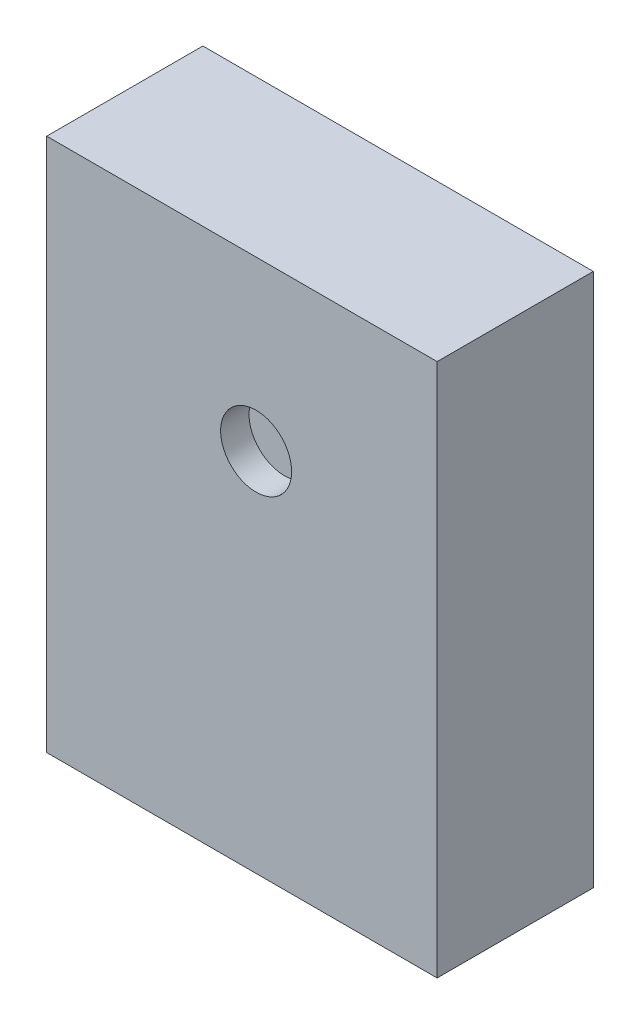
ISO-10303-21;
HEADER;
FILE_DESCRIPTION(('STEP AP214'),'2;1');
FILE_NAME('part.step','',(''),(''),'','','');
FILE_SCHEMA(('AUTOMOTIVE_DESIGN { 1 0 10303 214 1 1 1 1 }'));
ENDSEC;
DATA;
#1=APPLICATION_CONTEXT('core data for automotive mechanical design processes');
#2=APPLICATION_PROTOCOL_DEFINITION('international standard','automotive_design',2000,#1);
#3=PRODUCT_CONTEXT('',#1,'mechanical');
#4=PRODUCT('Part','Part','',(#3));
#5=PRODUCT_RELATED_PRODUCT_CATEGORY('part','',(#4));
#6=PRODUCT_DEFINITION_FORMATION('','',#4);
#7=PRODUCT_DEFINITION_CONTEXT('part definition',#1,'design');
#8=PRODUCT_DEFINITION('design','',#6,#7);
#9=PRODUCT_DEFINITION_SHAPE('','',#8);
#10=(LENGTH_UNIT() NAMED_UNIT(*) SI_UNIT(.MILLI.,.METRE.));
#11=(NAMED_UNIT(*) PLANE_ANGLE_UNIT() SI_UNIT($,.RADIAN.));
#12=(NAMED_UNIT(*) SI_UNIT($,.STERADIAN.) SOLID_ANGLE_UNIT());
#13=UNCERTAINTY_MEASURE_WITH_UNIT(LENGTH_MEASURE(1.E-05),#10,'distance_accuracy_value','');
#14=(GEOMETRIC_REPRESENTATION_CONTEXT(3) GLOBAL_UNCERTAINTY_ASSIGNED_CONTEXT((#13)) GLOBAL_UNIT_ASSIGNED_CONTEXT((#10,
#11,#12)) REPRESENTATION_CONTEXT('',''));
#15=CARTESIAN_POINT('',(0.,0.,0.));
#16=DIRECTION('',(0.,0.,1.));
#17=DIRECTION('',(1.,0.,0.));
#18=AXIS2_PLACEMENT_3D('',#15,#16,#17);
#19=CARTESIAN_POINT('',(1.375,1.88,1.1));
#20=DIRECTION('',(-1.,0.,0.));
#21=DIRECTION('',(0.,-1.,0.));
#22=AXIS2_PLACEMENT_3D('',#19,#20,#21);
#23=PLANE('',#22);
#24=DIRECTION('',(0.,1.,0.));
#25=VECTOR('',#24,1.);
#26=CARTESIAN_POINT('',(1.375,1.88,0.));
#27=LINE('',#26,#25);
#28=CARTESIAN_POINT('',(1.375,-1.88,0.));
#29=VERTEX_POINT('',#28);
#30=CARTESIAN_POINT('',(1.375,1.88,0.));
#31=VERTEX_POINT('',#30);
#32=EDGE_CURVE('E106',#29,#31,#27,.T.);
#33=ORIENTED_EDGE('',*,*,#32,.T.);
#34=DIRECTION('',(0.,0.,-1.));
#35=VECTOR('',#34,1.);
#36=CARTESIAN_POINT('',(1.375,1.88,1.1));
#37=LINE('',#36,#35);
#38=CARTESIAN_POINT('',(1.375,1.88,1.1));
#39=VERTEX_POINT('',#38);
#40=EDGE_CURVE('E11',#39,#31,#37,.T.);
#41=ORIENTED_EDGE('',*,*,#40,.F.);
#42=DIRECTION('',(0.,1.,0.));
#43=VECTOR('',#42,1.);
#44=CARTESIAN_POINT('',(1.375,1.88,1.1));
#45=LINE('',#44,#43);
#46=CARTESIAN_POINT('',(1.375,-1.88,1.1));
#47=VERTEX_POINT('',#46);
#48=EDGE_CURVE('E88',#47,#39,#45,.T.);
#49=ORIENTED_EDGE('',*,*,#48,.F.);
#50=DIRECTION('',(0.,0.,-1.));
#51=VECTOR('',#50,1.);
#52=CARTESIAN_POINT('',(1.375,-1.88,1.1));
#53=LINE('',#52,#51);
#54=EDGE_CURVE('E102',#47,#29,#53,.T.);
#55=ORIENTED_EDGE('',*,*,#54,.T.);
#56=EDGE_LOOP('',(#33,#41,#49,#55));
#57=FACE_BOUND('',#56,.T.);
#58=ADVANCED_FACE('F36',(#57),#23,.F.);
#59=CARTESIAN_POINT('',(-1.375,1.88,1.1));
#60=DIRECTION('',(0.,-1.,0.));
#61=DIRECTION('',(0.,0.,-1.));
#62=AXIS2_PLACEMENT_3D('',#59,#60,#61);
#63=PLANE('',#62);
#64=DIRECTION('',(-1.,0.,0.));
#65=VECTOR('',#64,1.);
#66=CARTESIAN_POINT('',(-1.375,1.88,0.));
#67=LINE('',#66,#65);
#68=CARTESIAN_POINT('',(-1.375,1.88,0.));
#69=VERTEX_POINT('',#68);
#70=EDGE_CURVE('E93',#31,#69,#67,.T.);
#71=ORIENTED_EDGE('',*,*,#70,.T.);
#72=DIRECTION('',(0.,0.,-1.));
#73=VECTOR('',#72,1.);
#74=CARTESIAN_POINT('',(-1.375,1.88,1.1));
#75=LINE('',#74,#73);
#76=CARTESIAN_POINT('',(-1.375,1.88,1.1));
#77=VERTEX_POINT('',#76);
#78=EDGE_CURVE('E45',#77,#69,#75,.T.);
#79=ORIENTED_EDGE('',*,*,#78,.F.);
#80=DIRECTION('',(-1.,0.,0.));
#81=VECTOR('',#80,1.);
#82=CARTESIAN_POINT('',(-1.375,1.88,1.1));
#83=LINE('',#82,#81);
#84=EDGE_CURVE('E83',#39,#77,#83,.T.);
#85=ORIENTED_EDGE('',*,*,#84,.F.);
#86=ORIENTED_EDGE('',*,*,#40,.T.);
#87=EDGE_LOOP('',(#71,#79,#85,#86));
#88=FACE_BOUND('',#87,.T.);
#89=ADVANCED_FACE('F92',(#88),#63,.F.);
#90=CARTESIAN_POINT('',(-1.375,1.88,1.1));
#91=DIRECTION('',(1.,0.,0.));
#92=DIRECTION('',(0.,1.,0.));
#93=AXIS2_PLACEMENT_3D('',#90,#91,#92);
#94=PLANE('',#93);
#95=DIRECTION('',(0.,-1.,0.));
#96=VECTOR('',#95,1.);
#97=CARTESIAN_POINT('',(-1.375,1.88,0.));
#98=LINE('',#97,#96);
#99=CARTESIAN_POINT('',(-1.375,-1.88,0.));
#100=VERTEX_POINT('',#99);
#101=EDGE_CURVE('E70',#69,#100,#98,.T.);
#102=ORIENTED_EDGE('',*,*,#101,.T.);
#103=DIRECTION('',(0.,0.,-1.));
#104=VECTOR('',#103,1.);
#105=CARTESIAN_POINT('',(-1.375,-1.88,1.1));
#106=LINE('',#105,#104);
#107=CARTESIAN_POINT('',(-1.375,-1.88,1.1));
#108=VERTEX_POINT('',#107);
#109=EDGE_CURVE('E95',#108,#100,#106,.T.);
#110=ORIENTED_EDGE('',*,*,#109,.F.);
#111=DIRECTION('',(0.,-1.,0.));
#112=VECTOR('',#111,1.);
#113=CARTESIAN_POINT('',(-1.375,1.88,1.1));
#114=LINE('',#113,#112);
#115=EDGE_CURVE('E86',#77,#108,#114,.T.);
#116=ORIENTED_EDGE('',*,*,#115,.F.);
#117=ORIENTED_EDGE('',*,*,#78,.T.);
#118=EDGE_LOOP('',(#102,#110,#116,#117));
#119=FACE_BOUND('',#118,.T.);
#120=ADVANCED_FACE('F96',(#119),#94,.F.);
#121=CARTESIAN_POINT('',(-1.375,-1.88,1.1));
#122=DIRECTION('',(0.,1.,0.));
#123=DIRECTION('',(0.,0.,1.));
#124=AXIS2_PLACEMENT_3D('',#121,#122,#123);
#125=PLANE('',#124);
#126=DIRECTION('',(1.,0.,0.));
#127=VECTOR('',#126,1.);
#128=CARTESIAN_POINT('',(-1.375,-1.88,0.));
#129=LINE('',#128,#127);
#130=EDGE_CURVE('E76',#100,#29,#129,.T.);
#131=ORIENTED_EDGE('',*,*,#130,.T.);
#132=ORIENTED_EDGE('',*,*,#54,.F.);
#133=DIRECTION('',(1.,0.,0.));
#134=VECTOR('',#133,1.);
#135=CARTESIAN_POINT('',(-1.375,-1.88,1.1));
#136=LINE('',#135,#134);
#137=EDGE_CURVE('E53',#108,#47,#136,.T.);
#138=ORIENTED_EDGE('',*,*,#137,.F.);
#139=ORIENTED_EDGE('',*,*,#109,.T.);
#140=EDGE_LOOP('',(#131,#132,#138,#139));
#141=FACE_BOUND('',#140,.T.);
#142=ADVANCED_FACE('F119',(#141),#125,.F.);
#143=CARTESIAN_POINT('',(0.,0.,1.1));
#144=DIRECTION('',(0.,0.,1.));
#145=DIRECTION('',(1.,0.,0.));
#146=AXIS2_PLACEMENT_3D('',#143,#144,#145);
#147=PLANE('',#146);
#148=CARTESIAN_POINT('',(0.1,0.696,1.1));
#149=DIRECTION('',(0.,0.,1.));
#150=DIRECTION('',(1.,0.,0.));
#151=AXIS2_PLACEMENT_3D('',#148,#149,#150);
#152=CIRCLE('',#151,0.25);
#153=CARTESIAN_POINT('',(0.35,0.696,1.1));
#154=VERTEX_POINT('',#153);
#155=EDGE_CURVE('E127',#154,#154,#152,.T.);
#156=ORIENTED_EDGE('',*,*,#155,.F.);
#157=EDGE_LOOP('',(#156));
#158=FACE_BOUND('',#157,.T.);
#159=ORIENTED_EDGE('',*,*,#48,.T.);
#160=ORIENTED_EDGE('',*,*,#84,.T.);
#161=ORIENTED_EDGE('',*,*,#115,.T.);
#162=ORIENTED_EDGE('',*,*,#137,.T.);
#163=EDGE_LOOP('',(#159,#160,#161,#162));
#164=FACE_BOUND('',#163,.T.);
#165=ADVANCED_FACE('F84',(#158,#164),#147,.T.);
#166=CARTESIAN_POINT('',(0.,0.,0.));
#167=DIRECTION('',(0.,0.,1.));
#168=DIRECTION('',(1.,0.,0.));
#169=AXIS2_PLACEMENT_3D('',#166,#167,#168);
#170=PLANE('',#169);
#171=ORIENTED_EDGE('',*,*,#32,.F.);
#172=ORIENTED_EDGE('',*,*,#130,.F.);
#173=ORIENTED_EDGE('',*,*,#101,.F.);
#174=ORIENTED_EDGE('',*,*,#70,.F.);
#175=EDGE_LOOP('',(#171,#172,#173,#174));
#176=FACE_BOUND('',#175,.T.);
#177=ADVANCED_FACE('F122',(#176),#170,.F.);
#178=CARTESIAN_POINT('',(0.1,0.696,0.9));
#179=DIRECTION('',(0.,0.,1.));
#180=DIRECTION('',(1.,0.,0.));
#181=AXIS2_PLACEMENT_3D('',#178,#179,#180);
#182=CYLINDRICAL_SURFACE('',#181,0.25);
#183=CARTESIAN_POINT('',(0.1,0.696,0.9));
#184=DIRECTION('',(0.,0.,1.));
#185=DIRECTION('',(1.,0.,0.));
#186=AXIS2_PLACEMENT_3D('',#183,#184,#185);
#187=CIRCLE('',#186,0.25);
#188=CARTESIAN_POINT('',(0.35,0.696,0.9));
#189=VERTEX_POINT('',#188);
#190=EDGE_CURVE('E110',#189,#189,#187,.T.);
#191=ORIENTED_EDGE('',*,*,#190,.F.);
#192=EDGE_LOOP('',(#191));
#193=FACE_BOUND('',#192,.T.);
#194=ORIENTED_EDGE('',*,*,#155,.T.);
#195=EDGE_LOOP('',(#194));
#196=FACE_BOUND('',#195,.T.);
#197=ADVANCED_FACE('F135',(#193,#196),#182,.F.);
#198=CARTESIAN_POINT('',(0.1,0.696,0.9));
#199=DIRECTION('',(0.,0.,1.));
#200=DIRECTION('',(1.,0.,0.));
#201=AXIS2_PLACEMENT_3D('',#198,#199,#200);
#202=PLANE('',#201);
#203=ORIENTED_EDGE('',*,*,#190,.T.);
#204=EDGE_LOOP('',(#203));
#205=FACE_BOUND('',#204,.T.);
#206=ADVANCED_FACE('F133',(#205),#202,.T.);
#207=CLOSED_SHELL('',(#58,#89,#120,#142,#165,#177,#197,#206));
#208=MANIFOLD_SOLID_BREP('B2',#207);
#209=ADVANCED_BREP_SHAPE_REPRESENTATION('',(#18,#208),#14);
#210=SHAPE_DEFINITION_REPRESENTATION(#9,#209);
ENDSEC;
END-ISO-10303-21;
